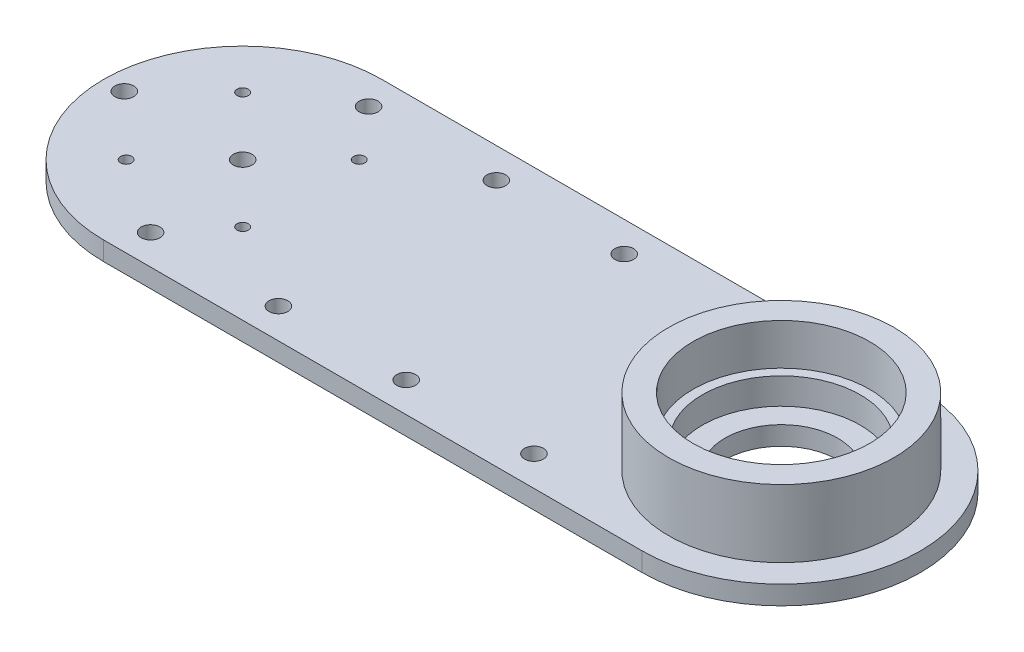
ISO-10303-21;
HEADER;
FILE_DESCRIPTION(('STEP AP214'),'2;1');
FILE_NAME('part.step','',(''),(''),'','','');
FILE_SCHEMA(('AUTOMOTIVE_DESIGN { 1 0 10303 214 1 1 1 1 }'));
ENDSEC;
DATA;
#1=APPLICATION_CONTEXT('core data for automotive mechanical design processes');
#2=APPLICATION_PROTOCOL_DEFINITION('international standard','automotive_design',2000,#1);
#3=PRODUCT_CONTEXT('',#1,'mechanical');
#4=PRODUCT('Part','Part','',(#3));
#5=PRODUCT_RELATED_PRODUCT_CATEGORY('part','',(#4));
#6=PRODUCT_DEFINITION_FORMATION('','',#4);
#7=PRODUCT_DEFINITION_CONTEXT('part definition',#1,'design');
#8=PRODUCT_DEFINITION('design','',#6,#7);
#9=PRODUCT_DEFINITION_SHAPE('','',#8);
#10=(LENGTH_UNIT() NAMED_UNIT(*) SI_UNIT(.MILLI.,.METRE.));
#11=(NAMED_UNIT(*) PLANE_ANGLE_UNIT() SI_UNIT($,.RADIAN.));
#12=(NAMED_UNIT(*) SI_UNIT($,.STERADIAN.) SOLID_ANGLE_UNIT());
#13=UNCERTAINTY_MEASURE_WITH_UNIT(LENGTH_MEASURE(1.E-05),#10,'distance_accuracy_value','');
#14=(GEOMETRIC_REPRESENTATION_CONTEXT(3) GLOBAL_UNCERTAINTY_ASSIGNED_CONTEXT((#13)) GLOBAL_UNIT_ASSIGNED_CONTEXT((#10,
#11,#12)) REPRESENTATION_CONTEXT('',''));
#15=CARTESIAN_POINT('',(0.,0.,0.));
#16=DIRECTION('',(0.,0.,1.));
#17=DIRECTION('',(1.,0.,0.));
#18=AXIS2_PLACEMENT_3D('',#15,#16,#17);
#19=CARTESIAN_POINT('',(0.,5.,0.));
#20=DIRECTION('',(0.,-1.,0.));
#21=DIRECTION('',(0.,0.,-1.));
#22=AXIS2_PLACEMENT_3D('',#19,#20,#21);
#23=PLANE('',#22);
#24=CARTESIAN_POINT('',(143.3,5.,0.));
#25=DIRECTION('',(0.,1.,0.));
#26=DIRECTION('',(0.,0.,1.));
#27=AXIS2_PLACEMENT_3D('',#24,#25,#26);
#28=CIRCLE('',#27,15.);
#29=CARTESIAN_POINT('',(143.3,5.,15.));
#30=VERTEX_POINT('',#29);
#31=EDGE_CURVE('E317',#30,#30,#28,.T.);
#32=ORIENTED_EDGE('',*,*,#31,.F.);
#33=EDGE_LOOP('',(#32));
#34=FACE_BOUND('',#33,.T.);
#35=CARTESIAN_POINT('',(143.3,5.,0.));
#36=DIRECTION('',(0.,1.,0.));
#37=DIRECTION('',(0.,0.,1.));
#38=AXIS2_PLACEMENT_3D('',#35,#36,#37);
#39=CIRCLE('',#38,21.0009523593574);
#40=CARTESIAN_POINT('',(143.3,5.,21.0009523593574));
#41=VERTEX_POINT('',#40);
#42=EDGE_CURVE('E233',#41,#41,#39,.T.);
#43=ORIENTED_EDGE('',*,*,#42,.T.);
#44=EDGE_LOOP('',(#43));
#45=FACE_BOUND('',#44,.T.);
#46=ADVANCED_FACE('F41',(#34,#45),#23,.F.);
#47=CARTESIAN_POINT('',(0.,5.,0.));
#48=DIRECTION('',(0.,-1.,0.));
#49=DIRECTION('',(0.,0.,-1.));
#50=AXIS2_PLACEMENT_3D('',#47,#48,#49);
#51=CYLINDRICAL_SURFACE('',#50,37.);
#52=CARTESIAN_POINT('',(0.,0.,0.));
#53=DIRECTION('',(0.,1.,0.));
#54=DIRECTION('',(0.,0.,-1.));
#55=AXIS2_PLACEMENT_3D('',#52,#53,#54);
#56=CIRCLE('',#55,37.);
#57=CARTESIAN_POINT('',(0.,0.,-37.));
#58=VERTEX_POINT('',#57);
#59=CARTESIAN_POINT('',(0.,0.,37.));
#60=VERTEX_POINT('',#59);
#61=EDGE_CURVE('E107',#58,#60,#56,.T.);
#62=ORIENTED_EDGE('',*,*,#61,.T.);
#63=DIRECTION('',(0.,-1.,0.));
#64=VECTOR('',#63,1.);
#65=CARTESIAN_POINT('',(0.,5.,37.));
#66=LINE('',#65,#64);
#67=CARTESIAN_POINT('',(0.,5.,37.));
#68=VERTEX_POINT('',#67);
#69=EDGE_CURVE('E49',#68,#60,#66,.T.);
#70=ORIENTED_EDGE('',*,*,#69,.F.);
#71=CARTESIAN_POINT('',(0.,5.,0.));
#72=DIRECTION('',(0.,1.,0.));
#73=DIRECTION('',(0.,0.,-1.));
#74=AXIS2_PLACEMENT_3D('',#71,#72,#73);
#75=CIRCLE('',#74,37.);
#76=CARTESIAN_POINT('',(0.,5.,-37.));
#77=VERTEX_POINT('',#76);
#78=EDGE_CURVE('E94',#77,#68,#75,.T.);
#79=ORIENTED_EDGE('',*,*,#78,.F.);
#80=DIRECTION('',(0.,-1.,0.));
#81=VECTOR('',#80,1.);
#82=CARTESIAN_POINT('',(0.,5.,-37.));
#83=LINE('',#82,#81);
#84=EDGE_CURVE('E102',#77,#58,#83,.T.);
#85=ORIENTED_EDGE('',*,*,#84,.T.);
#86=EDGE_LOOP('',(#62,#70,#79,#85));
#87=FACE_BOUND('',#86,.T.);
#88=ADVANCED_FACE('F43',(#87),#51,.T.);
#89=CARTESIAN_POINT('',(143.3,5.,37.));
#90=DIRECTION('',(0.,0.,-1.));
#91=DIRECTION('',(-1.,0.,0.));
#92=AXIS2_PLACEMENT_3D('',#89,#90,#91);
#93=PLANE('',#92);
#94=DIRECTION('',(1.,0.,0.));
#95=VECTOR('',#94,1.);
#96=CARTESIAN_POINT('',(143.3,0.,37.));
#97=LINE('',#96,#95);
#98=CARTESIAN_POINT('',(143.3,0.,37.));
#99=VERTEX_POINT('',#98);
#100=EDGE_CURVE('E97',#60,#99,#97,.T.);
#101=ORIENTED_EDGE('',*,*,#100,.T.);
#102=DIRECTION('',(0.,-1.,0.));
#103=VECTOR('',#102,1.);
#104=CARTESIAN_POINT('',(143.3,5.,37.));
#105=LINE('',#104,#103);
#106=CARTESIAN_POINT('',(143.3,5.,37.));
#107=VERTEX_POINT('',#106);
#108=EDGE_CURVE('E100',#107,#99,#105,.T.);
#109=ORIENTED_EDGE('',*,*,#108,.F.);
#110=DIRECTION('',(1.,0.,0.));
#111=VECTOR('',#110,1.);
#112=CARTESIAN_POINT('',(143.3,5.,37.));
#113=LINE('',#112,#111);
#114=EDGE_CURVE('E90',#68,#107,#113,.T.);
#115=ORIENTED_EDGE('',*,*,#114,.F.);
#116=ORIENTED_EDGE('',*,*,#69,.T.);
#117=EDGE_LOOP('',(#101,#109,#115,#116));
#118=FACE_BOUND('',#117,.T.);
#119=ADVANCED_FACE('F98',(#118),#93,.F.);
#120=CARTESIAN_POINT('',(143.3,5.,0.));
#121=DIRECTION('',(0.,-1.,0.));
#122=DIRECTION('',(0.,0.,-1.));
#123=AXIS2_PLACEMENT_3D('',#120,#121,#122);
#124=CYLINDRICAL_SURFACE('',#123,37.);
#125=CARTESIAN_POINT('',(143.3,0.,0.));
#126=DIRECTION('',(0.,1.,0.));
#127=DIRECTION('',(0.,0.,-1.));
#128=AXIS2_PLACEMENT_3D('',#125,#126,#127);
#129=CIRCLE('',#128,37.);
#130=CARTESIAN_POINT('',(143.3,0.,-37.));
#131=VERTEX_POINT('',#130);
#132=EDGE_CURVE('E73',#99,#131,#129,.T.);
#133=ORIENTED_EDGE('',*,*,#132,.T.);
#134=DIRECTION('',(0.,-1.,0.));
#135=VECTOR('',#134,1.);
#136=CARTESIAN_POINT('',(143.3,5.,-37.));
#137=LINE('',#136,#135);
#138=CARTESIAN_POINT('',(143.3,5.,-37.));
#139=VERTEX_POINT('',#138);
#140=EDGE_CURVE('E99',#139,#131,#137,.T.);
#141=ORIENTED_EDGE('',*,*,#140,.F.);
#142=CARTESIAN_POINT('',(143.3,5.,0.));
#143=DIRECTION('',(0.,1.,0.));
#144=DIRECTION('',(0.,0.,-1.));
#145=AXIS2_PLACEMENT_3D('',#142,#143,#144);
#146=CIRCLE('',#145,37.);
#147=EDGE_CURVE('E95',#107,#139,#146,.T.);
#148=ORIENTED_EDGE('',*,*,#147,.F.);
#149=ORIENTED_EDGE('',*,*,#108,.T.);
#150=EDGE_LOOP('',(#133,#141,#148,#149));
#151=FACE_BOUND('',#150,.T.);
#152=ADVANCED_FACE('F105',(#151),#124,.T.);
#153=CARTESIAN_POINT('',(0.,5.,-37.));
#154=DIRECTION('',(0.,0.,1.));
#155=DIRECTION('',(1.,0.,0.));
#156=AXIS2_PLACEMENT_3D('',#153,#154,#155);
#157=PLANE('',#156);
#158=DIRECTION('',(-1.,0.,0.));
#159=VECTOR('',#158,1.);
#160=CARTESIAN_POINT('',(0.,0.,-37.));
#161=LINE('',#160,#159);
#162=EDGE_CURVE('E83',#131,#58,#161,.T.);
#163=ORIENTED_EDGE('',*,*,#162,.T.);
#164=ORIENTED_EDGE('',*,*,#84,.F.);
#165=DIRECTION('',(-1.,0.,0.));
#166=VECTOR('',#165,1.);
#167=CARTESIAN_POINT('',(0.,5.,-37.));
#168=LINE('',#167,#166);
#169=EDGE_CURVE('E59',#139,#77,#168,.T.);
#170=ORIENTED_EDGE('',*,*,#169,.F.);
#171=ORIENTED_EDGE('',*,*,#140,.T.);
#172=EDGE_LOOP('',(#163,#164,#170,#171));
#173=FACE_BOUND('',#172,.T.);
#174=ADVANCED_FACE('F134',(#173),#157,.F.);
#175=CARTESIAN_POINT('',(143.3,5.,0.));
#176=DIRECTION('',(0.,-1.,0.));
#177=DIRECTION('',(0.,0.,-1.));
#178=AXIS2_PLACEMENT_3D('',#175,#176,#177);
#179=CIRCLE('',#178,30.0006666592594);
#180=CARTESIAN_POINT('',(143.3,5.,-30.0006666592594));
#181=VERTEX_POINT('',#180);
#182=EDGE_CURVE('E11',#181,#181,#179,.F.);
#183=ORIENTED_EDGE('',*,*,#182,.F.);
#184=EDGE_LOOP('',(#183));
#185=FACE_BOUND('',#184,.T.);
#186=CARTESIAN_POINT('',(-31.5,5.,0.));
#187=DIRECTION('',(0.,1.,0.));
#188=DIRECTION('',(0.,0.,1.));
#189=AXIS2_PLACEMENT_3D('',#186,#187,#188);
#190=CIRCLE('',#189,2.5);
#191=CARTESIAN_POINT('',(-31.5,5.,2.5));
#192=VERTEX_POINT('',#191);
#193=EDGE_CURVE('E241',#192,#192,#190,.T.);
#194=ORIENTED_EDGE('',*,*,#193,.F.);
#195=EDGE_LOOP('',(#194));
#196=FACE_BOUND('',#195,.T.);
#197=CARTESIAN_POINT('',(4.5,5.,29.));
#198=DIRECTION('',(0.,1.,0.));
#199=DIRECTION('',(0.,0.,1.));
#200=AXIS2_PLACEMENT_3D('',#197,#198,#199);
#201=CIRCLE('',#200,2.5);
#202=CARTESIAN_POINT('',(4.5,5.,31.5));
#203=VERTEX_POINT('',#202);
#204=EDGE_CURVE('E249',#203,#203,#201,.T.);
#205=ORIENTED_EDGE('',*,*,#204,.F.);
#206=EDGE_LOOP('',(#205));
#207=FACE_BOUND('',#206,.T.);
#208=CARTESIAN_POINT('',(38.5,5.,29.));
#209=DIRECTION('',(0.,1.,0.));
#210=DIRECTION('',(0.,0.,1.));
#211=AXIS2_PLACEMENT_3D('',#208,#209,#210);
#212=CIRCLE('',#211,2.5);
#213=CARTESIAN_POINT('',(38.5,5.,31.5));
#214=VERTEX_POINT('',#213);
#215=EDGE_CURVE('E258',#214,#214,#212,.T.);
#216=ORIENTED_EDGE('',*,*,#215,.F.);
#217=EDGE_LOOP('',(#216));
#218=FACE_BOUND('',#217,.T.);
#219=CARTESIAN_POINT('',(72.5,5.,29.));
#220=DIRECTION('',(0.,1.,0.));
#221=DIRECTION('',(0.,0.,1.));
#222=AXIS2_PLACEMENT_3D('',#219,#220,#221);
#223=CIRCLE('',#222,2.5);
#224=CARTESIAN_POINT('',(72.5,5.,31.5));
#225=VERTEX_POINT('',#224);
#226=EDGE_CURVE('E265',#225,#225,#223,.T.);
#227=ORIENTED_EDGE('',*,*,#226,.F.);
#228=EDGE_LOOP('',(#227));
#229=FACE_BOUND('',#228,.T.);
#230=CARTESIAN_POINT('',(106.5,5.,29.));
#231=DIRECTION('',(0.,1.,0.));
#232=DIRECTION('',(0.,0.,1.));
#233=AXIS2_PLACEMENT_3D('',#230,#231,#232);
#234=CIRCLE('',#233,2.5);
#235=CARTESIAN_POINT('',(106.5,5.,31.5));
#236=VERTEX_POINT('',#235);
#237=EDGE_CURVE('E268',#236,#236,#234,.T.);
#238=ORIENTED_EDGE('',*,*,#237,.F.);
#239=EDGE_LOOP('',(#238));
#240=FACE_BOUND('',#239,.T.);
#241=CARTESIAN_POINT('',(4.5,5.,-29.));
#242=DIRECTION('',(0.,1.,0.));
#243=DIRECTION('',(0.,0.,1.));
#244=AXIS2_PLACEMENT_3D('',#241,#242,#243);
#245=CIRCLE('',#244,2.5);
#246=CARTESIAN_POINT('',(4.5,5.,-26.5));
#247=VERTEX_POINT('',#246);
#248=EDGE_CURVE('E273',#247,#247,#245,.T.);
#249=ORIENTED_EDGE('',*,*,#248,.F.);
#250=EDGE_LOOP('',(#249));
#251=FACE_BOUND('',#250,.T.);
#252=CARTESIAN_POINT('',(38.5,5.,-29.));
#253=DIRECTION('',(0.,1.,0.));
#254=DIRECTION('',(0.,0.,1.));
#255=AXIS2_PLACEMENT_3D('',#252,#253,#254);
#256=CIRCLE('',#255,2.49999999999999);
#257=CARTESIAN_POINT('',(38.5,5.,-26.5));
#258=VERTEX_POINT('',#257);
#259=EDGE_CURVE('E278',#258,#258,#256,.T.);
#260=ORIENTED_EDGE('',*,*,#259,.F.);
#261=EDGE_LOOP('',(#260));
#262=FACE_BOUND('',#261,.T.);
#263=CARTESIAN_POINT('',(72.5,5.,-29.));
#264=DIRECTION('',(0.,1.,0.));
#265=DIRECTION('',(0.,0.,1.));
#266=AXIS2_PLACEMENT_3D('',#263,#264,#265);
#267=CIRCLE('',#266,2.49999999999999);
#268=CARTESIAN_POINT('',(72.5,5.,-26.5));
#269=VERTEX_POINT('',#268);
#270=EDGE_CURVE('E288',#269,#269,#267,.T.);
#271=ORIENTED_EDGE('',*,*,#270,.F.);
#272=EDGE_LOOP('',(#271));
#273=FACE_BOUND('',#272,.T.);
#274=CARTESIAN_POINT('',(106.5,5.,-29.));
#275=DIRECTION('',(0.,1.,0.));
#276=DIRECTION('',(0.,0.,1.));
#277=AXIS2_PLACEMENT_3D('',#274,#275,#276);
#278=CIRCLE('',#277,2.49999999999999);
#279=CARTESIAN_POINT('',(106.5,5.,-26.5));
#280=VERTEX_POINT('',#279);
#281=EDGE_CURVE('E236',#280,#280,#278,.T.);
#282=ORIENTED_EDGE('',*,*,#281,.F.);
#283=EDGE_LOOP('',(#282));
#284=FACE_BOUND('',#283,.T.);
#285=CARTESIAN_POINT('',(15.5,5.,15.5));
#286=DIRECTION('',(0.,1.,0.));
#287=DIRECTION('',(0.,0.,1.));
#288=AXIS2_PLACEMENT_3D('',#285,#286,#287);
#289=CIRCLE('',#288,1.5);
#290=CARTESIAN_POINT('',(15.5,5.,17.));
#291=VERTEX_POINT('',#290);
#292=EDGE_CURVE('E307',#291,#291,#289,.T.);
#293=ORIENTED_EDGE('',*,*,#292,.F.);
#294=EDGE_LOOP('',(#293));
#295=FACE_BOUND('',#294,.T.);
#296=CARTESIAN_POINT('',(15.5,5.,-15.5));
#297=DIRECTION('',(0.,1.,0.));
#298=DIRECTION('',(0.,0.,1.));
#299=AXIS2_PLACEMENT_3D('',#296,#297,#298);
#300=CIRCLE('',#299,1.5);
#301=CARTESIAN_POINT('',(15.5,5.,-14.));
#302=VERTEX_POINT('',#301);
#303=EDGE_CURVE('E298',#302,#302,#300,.T.);
#304=ORIENTED_EDGE('',*,*,#303,.F.);
#305=EDGE_LOOP('',(#304));
#306=FACE_BOUND('',#305,.T.);
#307=CARTESIAN_POINT('',(-15.5,5.,-15.5));
#308=DIRECTION('',(0.,1.,0.));
#309=DIRECTION('',(0.,0.,1.));
#310=AXIS2_PLACEMENT_3D('',#307,#308,#309);
#311=CIRCLE('',#310,1.5);
#312=CARTESIAN_POINT('',(-15.5,5.,-14.));
#313=VERTEX_POINT('',#312);
#314=EDGE_CURVE('E315',#313,#313,#311,.T.);
#315=ORIENTED_EDGE('',*,*,#314,.F.);
#316=EDGE_LOOP('',(#315));
#317=FACE_BOUND('',#316,.T.);
#318=CARTESIAN_POINT('',(-15.5,5.,15.5));
#319=DIRECTION('',(0.,1.,0.));
#320=DIRECTION('',(0.,0.,1.));
#321=AXIS2_PLACEMENT_3D('',#318,#319,#320);
#322=CIRCLE('',#321,1.5);
#323=CARTESIAN_POINT('',(-15.5,5.,17.));
#324=VERTEX_POINT('',#323);
#325=EDGE_CURVE('E294',#324,#324,#322,.T.);
#326=ORIENTED_EDGE('',*,*,#325,.F.);
#327=EDGE_LOOP('',(#326));
#328=FACE_BOUND('',#327,.T.);
#329=CARTESIAN_POINT('',(0.,5.,0.));
#330=DIRECTION('',(0.,1.,0.));
#331=DIRECTION('',(0.,0.,1.));
#332=AXIS2_PLACEMENT_3D('',#329,#330,#331);
#333=CIRCLE('',#332,2.5);
#334=CARTESIAN_POINT('',(0.,5.,2.5));
#335=VERTEX_POINT('',#334);
#336=EDGE_CURVE('E312',#335,#335,#333,.T.);
#337=ORIENTED_EDGE('',*,*,#336,.F.);
#338=EDGE_LOOP('',(#337));
#339=FACE_BOUND('',#338,.T.);
#340=ORIENTED_EDGE('',*,*,#78,.T.);
#341=ORIENTED_EDGE('',*,*,#114,.T.);
#342=ORIENTED_EDGE('',*,*,#147,.T.);
#343=ORIENTED_EDGE('',*,*,#169,.T.);
#344=EDGE_LOOP('',(#340,#341,#342,#343));
#345=FACE_BOUND('',#344,.T.);
#346=ADVANCED_FACE('F89',(#185,#196,#207,#218,#229,#240,#251,#262,#273,#284,#295,#306,#317,#328,
#339,#345),#23,.F.);
#347=CARTESIAN_POINT('',(0.,0.,0.));
#348=DIRECTION('',(0.,-1.,0.));
#349=DIRECTION('',(0.,0.,-1.));
#350=AXIS2_PLACEMENT_3D('',#347,#348,#349);
#351=PLANE('',#350);
#352=CARTESIAN_POINT('',(-31.5,0.,0.));
#353=DIRECTION('',(0.,1.,0.));
#354=DIRECTION('',(0.,0.,1.));
#355=AXIS2_PLACEMENT_3D('',#352,#353,#354);
#356=CIRCLE('',#355,2.5);
#357=CARTESIAN_POINT('',(-31.5,0.,2.5));
#358=VERTEX_POINT('',#357);
#359=EDGE_CURVE('E242',#358,#358,#356,.T.);
#360=ORIENTED_EDGE('',*,*,#359,.T.);
#361=EDGE_LOOP('',(#360));
#362=FACE_BOUND('',#361,.T.);
#363=CARTESIAN_POINT('',(4.5,0.,29.));
#364=DIRECTION('',(0.,1.,0.));
#365=DIRECTION('',(0.,0.,1.));
#366=AXIS2_PLACEMENT_3D('',#363,#364,#365);
#367=CIRCLE('',#366,2.5);
#368=CARTESIAN_POINT('',(4.5,0.,31.5));
#369=VERTEX_POINT('',#368);
#370=EDGE_CURVE('E250',#369,#369,#367,.T.);
#371=ORIENTED_EDGE('',*,*,#370,.T.);
#372=EDGE_LOOP('',(#371));
#373=FACE_BOUND('',#372,.T.);
#374=CARTESIAN_POINT('',(38.5,0.,29.));
#375=DIRECTION('',(0.,1.,0.));
#376=DIRECTION('',(0.,0.,1.));
#377=AXIS2_PLACEMENT_3D('',#374,#375,#376);
#378=CIRCLE('',#377,2.5);
#379=CARTESIAN_POINT('',(38.5,0.,31.5));
#380=VERTEX_POINT('',#379);
#381=EDGE_CURVE('E251',#380,#380,#378,.T.);
#382=ORIENTED_EDGE('',*,*,#381,.T.);
#383=EDGE_LOOP('',(#382));
#384=FACE_BOUND('',#383,.T.);
#385=CARTESIAN_POINT('',(72.5,0.,29.));
#386=DIRECTION('',(0.,1.,0.));
#387=DIRECTION('',(0.,0.,1.));
#388=AXIS2_PLACEMENT_3D('',#385,#386,#387);
#389=CIRCLE('',#388,2.5);
#390=CARTESIAN_POINT('',(72.5,0.,31.5));
#391=VERTEX_POINT('',#390);
#392=EDGE_CURVE('E259',#391,#391,#389,.T.);
#393=ORIENTED_EDGE('',*,*,#392,.T.);
#394=EDGE_LOOP('',(#393));
#395=FACE_BOUND('',#394,.T.);
#396=CARTESIAN_POINT('',(106.5,0.,29.));
#397=DIRECTION('',(0.,1.,0.));
#398=DIRECTION('',(0.,0.,1.));
#399=AXIS2_PLACEMENT_3D('',#396,#397,#398);
#400=CIRCLE('',#399,2.5);
#401=CARTESIAN_POINT('',(106.5,0.,31.5));
#402=VERTEX_POINT('',#401);
#403=EDGE_CURVE('E264',#402,#402,#400,.T.);
#404=ORIENTED_EDGE('',*,*,#403,.T.);
#405=EDGE_LOOP('',(#404));
#406=FACE_BOUND('',#405,.T.);
#407=CARTESIAN_POINT('',(4.5,0.,-29.));
#408=DIRECTION('',(0.,1.,0.));
#409=DIRECTION('',(0.,0.,1.));
#410=AXIS2_PLACEMENT_3D('',#407,#408,#409);
#411=CIRCLE('',#410,2.5);
#412=CARTESIAN_POINT('',(4.5,0.,-26.5));
#413=VERTEX_POINT('',#412);
#414=EDGE_CURVE('E271',#413,#413,#411,.T.);
#415=ORIENTED_EDGE('',*,*,#414,.T.);
#416=EDGE_LOOP('',(#415));
#417=FACE_BOUND('',#416,.T.);
#418=CARTESIAN_POINT('',(38.5,0.,-29.));
#419=DIRECTION('',(0.,1.,0.));
#420=DIRECTION('',(0.,0.,1.));
#421=AXIS2_PLACEMENT_3D('',#418,#419,#420);
#422=CIRCLE('',#421,2.49999999999999);
#423=CARTESIAN_POINT('',(38.5,0.,-26.5));
#424=VERTEX_POINT('',#423);
#425=EDGE_CURVE('E280',#424,#424,#422,.T.);
#426=ORIENTED_EDGE('',*,*,#425,.T.);
#427=EDGE_LOOP('',(#426));
#428=FACE_BOUND('',#427,.T.);
#429=CARTESIAN_POINT('',(72.5,0.,-29.));
#430=DIRECTION('',(0.,1.,0.));
#431=DIRECTION('',(0.,0.,1.));
#432=AXIS2_PLACEMENT_3D('',#429,#430,#431);
#433=CIRCLE('',#432,2.49999999999999);
#434=CARTESIAN_POINT('',(72.5,0.,-26.5));
#435=VERTEX_POINT('',#434);
#436=EDGE_CURVE('E284',#435,#435,#433,.T.);
#437=ORIENTED_EDGE('',*,*,#436,.T.);
#438=EDGE_LOOP('',(#437));
#439=FACE_BOUND('',#438,.T.);
#440=CARTESIAN_POINT('',(106.5,0.,-29.));
#441=DIRECTION('',(0.,1.,0.));
#442=DIRECTION('',(0.,0.,1.));
#443=AXIS2_PLACEMENT_3D('',#440,#441,#442);
#444=CIRCLE('',#443,2.49999999999999);
#445=CARTESIAN_POINT('',(106.5,0.,-26.5));
#446=VERTEX_POINT('',#445);
#447=EDGE_CURVE('E287',#446,#446,#444,.T.);
#448=ORIENTED_EDGE('',*,*,#447,.T.);
#449=EDGE_LOOP('',(#448));
#450=FACE_BOUND('',#449,.T.);
#451=CARTESIAN_POINT('',(15.5,0.,15.5));
#452=DIRECTION('',(0.,1.,0.));
#453=DIRECTION('',(0.,0.,1.));
#454=AXIS2_PLACEMENT_3D('',#451,#452,#453);
#455=CIRCLE('',#454,1.5);
#456=CARTESIAN_POINT('',(15.5,0.,17.));
#457=VERTEX_POINT('',#456);
#458=EDGE_CURVE('E300',#457,#457,#455,.T.);
#459=ORIENTED_EDGE('',*,*,#458,.T.);
#460=EDGE_LOOP('',(#459));
#461=FACE_BOUND('',#460,.T.);
#462=CARTESIAN_POINT('',(15.5,0.,-15.5));
#463=DIRECTION('',(0.,1.,0.));
#464=DIRECTION('',(0.,0.,1.));
#465=AXIS2_PLACEMENT_3D('',#462,#463,#464);
#466=CIRCLE('',#465,1.5);
#467=CARTESIAN_POINT('',(15.5,0.,-14.));
#468=VERTEX_POINT('',#467);
#469=EDGE_CURVE('E302',#468,#468,#466,.T.);
#470=ORIENTED_EDGE('',*,*,#469,.T.);
#471=EDGE_LOOP('',(#470));
#472=FACE_BOUND('',#471,.T.);
#473=CARTESIAN_POINT('',(143.3,0.,0.));
#474=DIRECTION('',(0.,1.,0.));
#475=DIRECTION('',(0.,0.,1.));
#476=AXIS2_PLACEMENT_3D('',#473,#474,#475);
#477=CIRCLE('',#476,15.);
#478=CARTESIAN_POINT('',(143.3,0.,15.));
#479=VERTEX_POINT('',#478);
#480=EDGE_CURVE('E301',#479,#479,#477,.T.);
#481=ORIENTED_EDGE('',*,*,#480,.T.);
#482=EDGE_LOOP('',(#481));
#483=FACE_BOUND('',#482,.T.);
#484=CARTESIAN_POINT('',(-15.5,0.,-15.5));
#485=DIRECTION('',(0.,1.,0.));
#486=DIRECTION('',(0.,0.,1.));
#487=AXIS2_PLACEMENT_3D('',#484,#485,#486);
#488=CIRCLE('',#487,1.5);
#489=CARTESIAN_POINT('',(-15.5,0.,-14.));
#490=VERTEX_POINT('',#489);
#491=EDGE_CURVE('E316',#490,#490,#488,.T.);
#492=ORIENTED_EDGE('',*,*,#491,.T.);
#493=EDGE_LOOP('',(#492));
#494=FACE_BOUND('',#493,.T.);
#495=CARTESIAN_POINT('',(-15.5,0.,15.5));
#496=DIRECTION('',(0.,1.,0.));
#497=DIRECTION('',(0.,0.,1.));
#498=AXIS2_PLACEMENT_3D('',#495,#496,#497);
#499=CIRCLE('',#498,1.5);
#500=CARTESIAN_POINT('',(-15.5,0.,17.));
#501=VERTEX_POINT('',#500);
#502=EDGE_CURVE('E244',#501,#501,#499,.T.);
#503=ORIENTED_EDGE('',*,*,#502,.T.);
#504=EDGE_LOOP('',(#503));
#505=FACE_BOUND('',#504,.T.);
#506=CARTESIAN_POINT('',(0.,0.,0.));
#507=DIRECTION('',(0.,1.,0.));
#508=DIRECTION('',(0.,0.,1.));
#509=AXIS2_PLACEMENT_3D('',#506,#507,#508);
#510=CIRCLE('',#509,2.5);
#511=CARTESIAN_POINT('',(0.,0.,2.5));
#512=VERTEX_POINT('',#511);
#513=EDGE_CURVE('E112',#512,#512,#510,.T.);
#514=ORIENTED_EDGE('',*,*,#513,.T.);
#515=EDGE_LOOP('',(#514));
#516=FACE_BOUND('',#515,.T.);
#517=ORIENTED_EDGE('',*,*,#61,.F.);
#518=ORIENTED_EDGE('',*,*,#162,.F.);
#519=ORIENTED_EDGE('',*,*,#132,.F.);
#520=ORIENTED_EDGE('',*,*,#100,.F.);
#521=EDGE_LOOP('',(#517,#518,#519,#520));
#522=FACE_BOUND('',#521,.T.);
#523=ADVANCED_FACE('F116',(#362,#373,#384,#395,#406,#417,#428,#439,#450,#461,#472,#483,#494,
#505,#516,#522),#351,.T.);
#524=CARTESIAN_POINT('',(0.,0.,0.));
#525=DIRECTION('',(0.,1.,0.));
#526=DIRECTION('',(0.,0.,1.));
#527=AXIS2_PLACEMENT_3D('',#524,#525,#526);
#528=CYLINDRICAL_SURFACE('',#527,2.5);
#529=ORIENTED_EDGE('',*,*,#513,.F.);
#530=EDGE_LOOP('',(#529));
#531=FACE_BOUND('',#530,.T.);
#532=ORIENTED_EDGE('',*,*,#336,.T.);
#533=EDGE_LOOP('',(#532));
#534=FACE_BOUND('',#533,.T.);
#535=ADVANCED_FACE('F123',(#531,#534),#528,.F.);
#536=CARTESIAN_POINT('',(-15.5,0.,15.5));
#537=DIRECTION('',(0.,1.,0.));
#538=DIRECTION('',(0.,0.,1.));
#539=AXIS2_PLACEMENT_3D('',#536,#537,#538);
#540=CYLINDRICAL_SURFACE('',#539,1.5);
#541=ORIENTED_EDGE('',*,*,#502,.F.);
#542=EDGE_LOOP('',(#541));
#543=FACE_BOUND('',#542,.T.);
#544=ORIENTED_EDGE('',*,*,#325,.T.);
#545=EDGE_LOOP('',(#544));
#546=FACE_BOUND('',#545,.T.);
#547=ADVANCED_FACE('F129',(#543,#546),#540,.F.);
#548=CARTESIAN_POINT('',(-15.5,0.,-15.5));
#549=DIRECTION('',(0.,1.,0.));
#550=DIRECTION('',(0.,0.,1.));
#551=AXIS2_PLACEMENT_3D('',#548,#549,#550);
#552=CYLINDRICAL_SURFACE('',#551,1.5);
#553=ORIENTED_EDGE('',*,*,#491,.F.);
#554=EDGE_LOOP('',(#553));
#555=FACE_BOUND('',#554,.T.);
#556=ORIENTED_EDGE('',*,*,#314,.T.);
#557=EDGE_LOOP('',(#556));
#558=FACE_BOUND('',#557,.T.);
#559=ADVANCED_FACE('F153',(#555,#558),#552,.F.);
#560=CARTESIAN_POINT('',(143.3,0.,0.));
#561=DIRECTION('',(0.,1.,0.));
#562=DIRECTION('',(0.,0.,1.));
#563=AXIS2_PLACEMENT_3D('',#560,#561,#562);
#564=CYLINDRICAL_SURFACE('',#563,15.);
#565=ORIENTED_EDGE('',*,*,#480,.F.);
#566=EDGE_LOOP('',(#565));
#567=FACE_BOUND('',#566,.T.);
#568=ORIENTED_EDGE('',*,*,#31,.T.);
#569=EDGE_LOOP('',(#568));
#570=FACE_BOUND('',#569,.T.);
#571=ADVANCED_FACE('F149',(#567,#570),#564,.F.);
#572=CARTESIAN_POINT('',(15.5,0.,-15.5));
#573=DIRECTION('',(0.,1.,0.));
#574=DIRECTION('',(0.,0.,1.));
#575=AXIS2_PLACEMENT_3D('',#572,#573,#574);
#576=CYLINDRICAL_SURFACE('',#575,1.5);
#577=ORIENTED_EDGE('',*,*,#469,.F.);
#578=EDGE_LOOP('',(#577));
#579=FACE_BOUND('',#578,.T.);
#580=ORIENTED_EDGE('',*,*,#303,.T.);
#581=EDGE_LOOP('',(#580));
#582=FACE_BOUND('',#581,.T.);
#583=ADVANCED_FACE('F155',(#579,#582),#576,.F.);
#584=CARTESIAN_POINT('',(15.5,0.,15.5));
#585=DIRECTION('',(0.,1.,0.));
#586=DIRECTION('',(0.,0.,1.));
#587=AXIS2_PLACEMENT_3D('',#584,#585,#586);
#588=CYLINDRICAL_SURFACE('',#587,1.5);
#589=ORIENTED_EDGE('',*,*,#458,.F.);
#590=EDGE_LOOP('',(#589));
#591=FACE_BOUND('',#590,.T.);
#592=ORIENTED_EDGE('',*,*,#292,.T.);
#593=EDGE_LOOP('',(#592));
#594=FACE_BOUND('',#593,.T.);
#595=ADVANCED_FACE('F158',(#591,#594),#588,.F.);
#596=CARTESIAN_POINT('',(106.5,0.,-29.));
#597=DIRECTION('',(0.,1.,0.));
#598=DIRECTION('',(0.,0.,1.));
#599=AXIS2_PLACEMENT_3D('',#596,#597,#598);
#600=CYLINDRICAL_SURFACE('',#599,2.49999999999999);
#601=ORIENTED_EDGE('',*,*,#447,.F.);
#602=EDGE_LOOP('',(#601));
#603=FACE_BOUND('',#602,.T.);
#604=ORIENTED_EDGE('',*,*,#281,.T.);
#605=EDGE_LOOP('',(#604));
#606=FACE_BOUND('',#605,.T.);
#607=ADVANCED_FACE('F159',(#603,#606),#600,.F.);
#608=CARTESIAN_POINT('',(72.5,0.,-29.));
#609=DIRECTION('',(0.,1.,0.));
#610=DIRECTION('',(0.,0.,1.));
#611=AXIS2_PLACEMENT_3D('',#608,#609,#610);
#612=CYLINDRICAL_SURFACE('',#611,2.49999999999999);
#613=ORIENTED_EDGE('',*,*,#436,.F.);
#614=EDGE_LOOP('',(#613));
#615=FACE_BOUND('',#614,.T.);
#616=ORIENTED_EDGE('',*,*,#270,.T.);
#617=EDGE_LOOP('',(#616));
#618=FACE_BOUND('',#617,.T.);
#619=ADVANCED_FACE('F166',(#615,#618),#612,.F.);
#620=CARTESIAN_POINT('',(38.5,0.,-29.));
#621=DIRECTION('',(0.,1.,0.));
#622=DIRECTION('',(0.,0.,1.));
#623=AXIS2_PLACEMENT_3D('',#620,#621,#622);
#624=CYLINDRICAL_SURFACE('',#623,2.49999999999999);
#625=ORIENTED_EDGE('',*,*,#425,.F.);
#626=EDGE_LOOP('',(#625));
#627=FACE_BOUND('',#626,.T.);
#628=ORIENTED_EDGE('',*,*,#259,.T.);
#629=EDGE_LOOP('',(#628));
#630=FACE_BOUND('',#629,.T.);
#631=ADVANCED_FACE('F174',(#627,#630),#624,.F.);
#632=CARTESIAN_POINT('',(4.5,0.,-29.));
#633=DIRECTION('',(0.,1.,0.));
#634=DIRECTION('',(0.,0.,1.));
#635=AXIS2_PLACEMENT_3D('',#632,#633,#634);
#636=CYLINDRICAL_SURFACE('',#635,2.5);
#637=ORIENTED_EDGE('',*,*,#414,.F.);
#638=EDGE_LOOP('',(#637));
#639=FACE_BOUND('',#638,.T.);
#640=ORIENTED_EDGE('',*,*,#248,.T.);
#641=EDGE_LOOP('',(#640));
#642=FACE_BOUND('',#641,.T.);
#643=ADVANCED_FACE('F180',(#639,#642),#636,.F.);
#644=CARTESIAN_POINT('',(106.5,0.,29.));
#645=DIRECTION('',(0.,1.,0.));
#646=DIRECTION('',(0.,0.,1.));
#647=AXIS2_PLACEMENT_3D('',#644,#645,#646);
#648=CYLINDRICAL_SURFACE('',#647,2.5);
#649=ORIENTED_EDGE('',*,*,#403,.F.);
#650=EDGE_LOOP('',(#649));
#651=FACE_BOUND('',#650,.T.);
#652=ORIENTED_EDGE('',*,*,#237,.T.);
#653=EDGE_LOOP('',(#652));
#654=FACE_BOUND('',#653,.T.);
#655=ADVANCED_FACE('F182',(#651,#654),#648,.F.);
#656=CARTESIAN_POINT('',(72.5,0.,29.));
#657=DIRECTION('',(0.,1.,0.));
#658=DIRECTION('',(0.,0.,1.));
#659=AXIS2_PLACEMENT_3D('',#656,#657,#658);
#660=CYLINDRICAL_SURFACE('',#659,2.5);
#661=ORIENTED_EDGE('',*,*,#392,.F.);
#662=EDGE_LOOP('',(#661));
#663=FACE_BOUND('',#662,.T.);
#664=ORIENTED_EDGE('',*,*,#226,.T.);
#665=EDGE_LOOP('',(#664));
#666=FACE_BOUND('',#665,.T.);
#667=ADVANCED_FACE('F183',(#663,#666),#660,.F.);
#668=CARTESIAN_POINT('',(38.5,0.,29.));
#669=DIRECTION('',(0.,1.,0.));
#670=DIRECTION('',(0.,0.,1.));
#671=AXIS2_PLACEMENT_3D('',#668,#669,#670);
#672=CYLINDRICAL_SURFACE('',#671,2.5);
#673=ORIENTED_EDGE('',*,*,#381,.F.);
#674=EDGE_LOOP('',(#673));
#675=FACE_BOUND('',#674,.T.);
#676=ORIENTED_EDGE('',*,*,#215,.T.);
#677=EDGE_LOOP('',(#676));
#678=FACE_BOUND('',#677,.T.);
#679=ADVANCED_FACE('F186',(#675,#678),#672,.F.);
#680=CARTESIAN_POINT('',(4.5,0.,29.));
#681=DIRECTION('',(0.,1.,0.));
#682=DIRECTION('',(0.,0.,1.));
#683=AXIS2_PLACEMENT_3D('',#680,#681,#682);
#684=CYLINDRICAL_SURFACE('',#683,2.5);
#685=ORIENTED_EDGE('',*,*,#370,.F.);
#686=EDGE_LOOP('',(#685));
#687=FACE_BOUND('',#686,.T.);
#688=ORIENTED_EDGE('',*,*,#204,.T.);
#689=EDGE_LOOP('',(#688));
#690=FACE_BOUND('',#689,.T.);
#691=ADVANCED_FACE('F191',(#687,#690),#684,.F.);
#692=CARTESIAN_POINT('',(-31.5,0.,0.));
#693=DIRECTION('',(0.,1.,0.));
#694=DIRECTION('',(0.,0.,1.));
#695=AXIS2_PLACEMENT_3D('',#692,#693,#694);
#696=CYLINDRICAL_SURFACE('',#695,2.5);
#697=ORIENTED_EDGE('',*,*,#359,.F.);
#698=EDGE_LOOP('',(#697));
#699=FACE_BOUND('',#698,.T.);
#700=ORIENTED_EDGE('',*,*,#193,.T.);
#701=EDGE_LOOP('',(#700));
#702=FACE_BOUND('',#701,.T.);
#703=ADVANCED_FACE('F197',(#699,#702),#696,.F.);
#704=CARTESIAN_POINT('',(143.3,12.,0.));
#705=DIRECTION('',(0.,1.,0.));
#706=DIRECTION('',(0.,0.,1.));
#707=AXIS2_PLACEMENT_3D('',#704,#705,#706);
#708=PLANE('',#707);
#709=CARTESIAN_POINT('',(143.3,12.,0.));
#710=DIRECTION('',(0.,1.,0.));
#711=DIRECTION('',(0.,0.,1.));
#712=AXIS2_PLACEMENT_3D('',#709,#710,#711);
#713=CIRCLE('',#712,23.5);
#714=CARTESIAN_POINT('',(143.3,12.,23.5));
#715=VERTEX_POINT('',#714);
#716=EDGE_CURVE('E229',#715,#715,#713,.T.);
#717=ORIENTED_EDGE('',*,*,#716,.T.);
#718=EDGE_LOOP('',(#717));
#719=FACE_BOUND('',#718,.T.);
#720=CARTESIAN_POINT('',(143.3,12.,0.));
#721=DIRECTION('',(0.,1.,0.));
#722=DIRECTION('',(0.,0.,1.));
#723=AXIS2_PLACEMENT_3D('',#720,#721,#722);
#724=CIRCLE('',#723,21.0009523593574);
#725=CARTESIAN_POINT('',(143.3,12.,21.0009523593574));
#726=VERTEX_POINT('',#725);
#727=EDGE_CURVE('E234',#726,#726,#724,.T.);
#728=ORIENTED_EDGE('',*,*,#727,.F.);
#729=EDGE_LOOP('',(#728));
#730=FACE_BOUND('',#729,.T.);
#731=ADVANCED_FACE('F199',(#719,#730),#708,.T.);
#732=CARTESIAN_POINT('',(143.3,12.,0.));
#733=DIRECTION('',(0.,-1.,0.));
#734=DIRECTION('',(0.,0.,-1.));
#735=AXIS2_PLACEMENT_3D('',#732,#733,#734);
#736=CYLINDRICAL_SURFACE('',#735,21.0009523593574);
#737=ORIENTED_EDGE('',*,*,#727,.T.);
#738=EDGE_LOOP('',(#737));
#739=FACE_BOUND('',#738,.T.);
#740=ORIENTED_EDGE('',*,*,#42,.F.);
#741=EDGE_LOOP('',(#740));
#742=FACE_BOUND('',#741,.T.);
#743=ADVANCED_FACE('F201',(#739,#742),#736,.F.);
#744=CARTESIAN_POINT('',(143.3,23.,0.));
#745=DIRECTION('',(0.,-1.,0.));
#746=DIRECTION('',(0.,0.,-1.));
#747=AXIS2_PLACEMENT_3D('',#744,#745,#746);
#748=CYLINDRICAL_SURFACE('',#747,23.5);
#749=ORIENTED_EDGE('',*,*,#716,.F.);
#750=EDGE_LOOP('',(#749));
#751=FACE_BOUND('',#750,.T.);
#752=CARTESIAN_POINT('',(143.3,23.,0.));
#753=DIRECTION('',(0.,1.,0.));
#754=DIRECTION('',(0.,0.,1.));
#755=AXIS2_PLACEMENT_3D('',#752,#753,#754);
#756=CIRCLE('',#755,23.5);
#757=CARTESIAN_POINT('',(143.3,23.,23.5));
#758=VERTEX_POINT('',#757);
#759=EDGE_CURVE('E221',#758,#758,#756,.F.);
#760=ORIENTED_EDGE('',*,*,#759,.F.);
#761=EDGE_LOOP('',(#760));
#762=FACE_BOUND('',#761,.T.);
#763=ADVANCED_FACE('F210',(#751,#762),#748,.F.);
#764=CARTESIAN_POINT('',(143.3,23.,0.));
#765=DIRECTION('',(0.,-1.,0.));
#766=DIRECTION('',(0.,0.,-1.));
#767=AXIS2_PLACEMENT_3D('',#764,#765,#766);
#768=CYLINDRICAL_SURFACE('',#767,30.0006666592594);
#769=CARTESIAN_POINT('',(143.3,23.,0.));
#770=DIRECTION('',(0.,1.,0.));
#771=DIRECTION('',(0.,0.,1.));
#772=AXIS2_PLACEMENT_3D('',#769,#770,#771);
#773=CIRCLE('',#772,30.0006666592594);
#774=CARTESIAN_POINT('',(143.3,23.,30.0006666592594));
#775=VERTEX_POINT('',#774);
#776=EDGE_CURVE('E230',#775,#775,#773,.T.);
#777=ORIENTED_EDGE('',*,*,#776,.F.);
#778=EDGE_LOOP('',(#777));
#779=FACE_BOUND('',#778,.T.);
#780=ORIENTED_EDGE('',*,*,#182,.T.);
#781=EDGE_LOOP('',(#780));
#782=FACE_BOUND('',#781,.T.);
#783=ADVANCED_FACE('F211',(#779,#782),#768,.T.);
#784=CARTESIAN_POINT('',(0.,23.,0.));
#785=DIRECTION('',(0.,1.,0.));
#786=DIRECTION('',(0.,0.,1.));
#787=AXIS2_PLACEMENT_3D('',#784,#785,#786);
#788=PLANE('',#787);
#789=ORIENTED_EDGE('',*,*,#759,.T.);
#790=EDGE_LOOP('',(#789));
#791=FACE_BOUND('',#790,.T.);
#792=ORIENTED_EDGE('',*,*,#776,.T.);
#793=EDGE_LOOP('',(#792));
#794=FACE_BOUND('',#793,.T.);
#795=ADVANCED_FACE('F214',(#791,#794),#788,.T.);
#796=CLOSED_SHELL('',(#46,#88,#119,#152,#174,#346,#523,#535,#547,#559,#571,#583,#595,#607,#619,
#631,#643,#655,#667,#679,#691,#703,#731,#743,#763,#783,#795));
#797=MANIFOLD_SOLID_BREP('B2',#796);
#798=ADVANCED_BREP_SHAPE_REPRESENTATION('',(#18,#797),#14);
#799=SHAPE_DEFINITION_REPRESENTATION(#9,#798);
ENDSEC;
END-ISO-10303-21;
